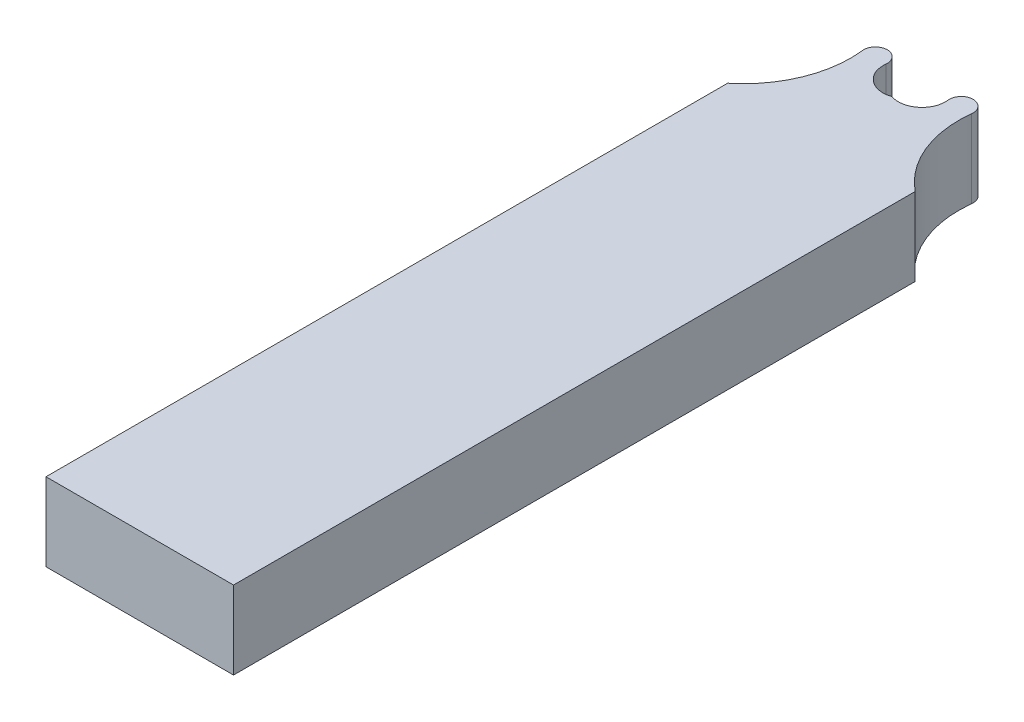
ISO-10303-21;
HEADER;
FILE_DESCRIPTION(('STEP AP214'),'2;1');
FILE_NAME('part.step','',(''),(''),'','','');
FILE_SCHEMA(('AUTOMOTIVE_DESIGN { 1 0 10303 214 1 1 1 1 }'));
ENDSEC;
DATA;
#1=APPLICATION_CONTEXT('core data for automotive mechanical design processes');
#2=APPLICATION_PROTOCOL_DEFINITION('international standard','automotive_design',2000,#1);
#3=PRODUCT_CONTEXT('',#1,'mechanical');
#4=PRODUCT('Part','Part','',(#3));
#5=PRODUCT_RELATED_PRODUCT_CATEGORY('part','',(#4));
#6=PRODUCT_DEFINITION_FORMATION('','',#4);
#7=PRODUCT_DEFINITION_CONTEXT('part definition',#1,'design');
#8=PRODUCT_DEFINITION('design','',#6,#7);
#9=PRODUCT_DEFINITION_SHAPE('','',#8);
#10=(LENGTH_UNIT() NAMED_UNIT(*) SI_UNIT(.MILLI.,.METRE.));
#11=(NAMED_UNIT(*) PLANE_ANGLE_UNIT() SI_UNIT($,.RADIAN.));
#12=(NAMED_UNIT(*) SI_UNIT($,.STERADIAN.) SOLID_ANGLE_UNIT());
#13=UNCERTAINTY_MEASURE_WITH_UNIT(LENGTH_MEASURE(1.E-05),#10,'distance_accuracy_value','');
#14=(GEOMETRIC_REPRESENTATION_CONTEXT(3) GLOBAL_UNCERTAINTY_ASSIGNED_CONTEXT((#13)) GLOBAL_UNIT_ASSIGNED_CONTEXT((#10,
#11,#12)) REPRESENTATION_CONTEXT('',''));
#15=CARTESIAN_POINT('',(0.,0.,0.));
#16=DIRECTION('',(0.,0.,1.));
#17=DIRECTION('',(1.,0.,0.));
#18=AXIS2_PLACEMENT_3D('',#15,#16,#17);
#19=CARTESIAN_POINT('',(-35.1155,0.,35.1155000000002));
#20=DIRECTION('',(-1.,0.,0.));
#21=DIRECTION('',(0.,0.,1.));
#22=AXIS2_PLACEMENT_3D('',#19,#20,#21);
#23=PLANE('',#22);
#24=DIRECTION('',(0.,-1.,0.));
#25=VECTOR('',#24,1.);
#26=CARTESIAN_POINT('',(-35.1155,29.21,-105.41));
#27=LINE('',#26,#25);
#28=CARTESIAN_POINT('',(-35.1155,29.21,-105.41));
#29=VERTEX_POINT('',#28);
#30=CARTESIAN_POINT('',(-35.1155,0.,-105.41));
#31=VERTEX_POINT('',#30);
#32=EDGE_CURVE('E144',#29,#31,#27,.T.);
#33=ORIENTED_EDGE('',*,*,#32,.T.);
#34=DIRECTION('',(0.,0.,1.));
#35=VECTOR('',#34,1.);
#36=CARTESIAN_POINT('',(-35.1155,0.,149.86));
#37=LINE('',#36,#35);
#38=CARTESIAN_POINT('',(-35.1155,0.,149.86));
#39=VERTEX_POINT('',#38);
#40=EDGE_CURVE('E11',#31,#39,#37,.T.);
#41=ORIENTED_EDGE('',*,*,#40,.T.);
#42=DIRECTION('',(0.,-1.,0.));
#43=VECTOR('',#42,1.);
#44=CARTESIAN_POINT('',(-35.1155,29.21,149.86));
#45=LINE('',#44,#43);
#46=CARTESIAN_POINT('',(-35.1155,29.21,149.86));
#47=VERTEX_POINT('',#46);
#48=EDGE_CURVE('E196',#47,#39,#45,.T.);
#49=ORIENTED_EDGE('',*,*,#48,.F.);
#50=DIRECTION('',(0.,0.,1.));
#51=VECTOR('',#50,1.);
#52=CARTESIAN_POINT('',(-35.1155,29.21,149.86));
#53=LINE('',#52,#51);
#54=EDGE_CURVE('E41',#29,#47,#53,.T.);
#55=ORIENTED_EDGE('',*,*,#54,.F.);
#56=EDGE_LOOP('',(#33,#41,#49,#55));
#57=FACE_BOUND('',#56,.T.);
#58=ADVANCED_FACE('F37',(#57),#23,.T.);
#59=CARTESIAN_POINT('',(35.1155,0.,-14.1463446288162));
#60=DIRECTION('',(1.,0.,0.));
#61=DIRECTION('',(0.,0.,-1.));
#62=AXIS2_PLACEMENT_3D('',#59,#60,#61);
#63=PLANE('',#62);
#64=DIRECTION('',(0.,-1.,0.));
#65=VECTOR('',#64,1.);
#66=CARTESIAN_POINT('',(35.1155,29.21,149.86));
#67=LINE('',#66,#65);
#68=CARTESIAN_POINT('',(35.1155,29.21,149.86));
#69=VERTEX_POINT('',#68);
#70=CARTESIAN_POINT('',(35.1155,0.,149.86));
#71=VERTEX_POINT('',#70);
#72=EDGE_CURVE('E120',#69,#71,#67,.T.);
#73=ORIENTED_EDGE('',*,*,#72,.T.);
#74=DIRECTION('',(0.,0.,-1.));
#75=VECTOR('',#74,1.);
#76=CARTESIAN_POINT('',(35.1155,0.,149.86));
#77=LINE('',#76,#75);
#78=CARTESIAN_POINT('',(35.1155,0.,-105.41));
#79=VERTEX_POINT('',#78);
#80=EDGE_CURVE('E114',#71,#79,#77,.T.);
#81=ORIENTED_EDGE('',*,*,#80,.T.);
#82=DIRECTION('',(0.,-1.,0.));
#83=VECTOR('',#82,1.);
#84=CARTESIAN_POINT('',(35.1155,29.21,-105.41));
#85=LINE('',#84,#83);
#86=CARTESIAN_POINT('',(35.1155,29.21,-105.41));
#87=VERTEX_POINT('',#86);
#88=EDGE_CURVE('E118',#87,#79,#85,.T.);
#89=ORIENTED_EDGE('',*,*,#88,.F.);
#90=DIRECTION('',(0.,0.,-1.));
#91=VECTOR('',#90,1.);
#92=CARTESIAN_POINT('',(35.1155,29.21,149.86));
#93=LINE('',#92,#91);
#94=EDGE_CURVE('E153',#69,#87,#93,.T.);
#95=ORIENTED_EDGE('',*,*,#94,.F.);
#96=EDGE_LOOP('',(#73,#81,#89,#95));
#97=FACE_BOUND('',#96,.T.);
#98=ADVANCED_FACE('F116',(#97),#63,.T.);
#99=CARTESIAN_POINT('',(-60.3181446143553,0.,-136.622759184095));
#100=DIRECTION('',(0.,-1.,0.));
#101=DIRECTION('',(0.,0.,-1.));
#102=AXIS2_PLACEMENT_3D('',#99,#100,#101);
#103=PLANE('',#102);
#104=ORIENTED_EDGE('',*,*,#40,.F.);
#105=CARTESIAN_POINT('',(-60.3181446143553,0.,-136.622759184095));
#106=DIRECTION('',(0.,-1.,0.));
#107=DIRECTION('',(0.,0.,-1.));
#108=AXIS2_PLACEMENT_3D('',#105,#106,#107);
#109=CIRCLE('',#108,40.1174479677087);
#110=CARTESIAN_POINT('',(-20.4654381266415,0.,-141.224));
#111=VERTEX_POINT('',#110);
#112=EDGE_CURVE('E154',#111,#31,#109,.T.);
#113=ORIENTED_EDGE('',*,*,#112,.F.);
#114=CARTESIAN_POINT('',(-16.0655,0.,-141.732));
#115=DIRECTION('',(0.,1.,0.));
#116=DIRECTION('',(0.,0.,-1.));
#117=AXIS2_PLACEMENT_3D('',#114,#115,#116);
#118=CIRCLE('',#117,4.42916691018457);
#119=CARTESIAN_POINT('',(-11.6655618733584,0.,-141.224));
#120=VERTEX_POINT('',#119);
#121=EDGE_CURVE('E156',#120,#111,#118,.T.);
#122=ORIENTED_EDGE('',*,*,#121,.F.);
#123=CARTESIAN_POINT('',(-2.8656856200749,0.,-140.208));
#124=DIRECTION('',(0.,-1.,0.));
#125=DIRECTION('',(0.,0.,1.));
#126=AXIS2_PLACEMENT_3D('',#123,#124,#125);
#127=CIRCLE('',#126,8.85833382036956);
#128=CARTESIAN_POINT('',(0.,0.,-131.826));
#129=VERTEX_POINT('',#128);
#130=EDGE_CURVE('E161',#129,#120,#127,.T.);
#131=ORIENTED_EDGE('',*,*,#130,.F.);
#132=CARTESIAN_POINT('',(2.86568562007493,0.,-140.208));
#133=DIRECTION('',(0.,-1.,0.));
#134=DIRECTION('',(0.,0.,-1.));
#135=AXIS2_PLACEMENT_3D('',#132,#133,#134);
#136=CIRCLE('',#135,8.85833382036956);
#137=CARTESIAN_POINT('',(11.6655618733585,0.,-141.224));
#138=VERTEX_POINT('',#137);
#139=EDGE_CURVE('E136',#138,#129,#136,.T.);
#140=ORIENTED_EDGE('',*,*,#139,.F.);
#141=CARTESIAN_POINT('',(16.0655,0.,-141.732));
#142=DIRECTION('',(0.,1.,0.));
#143=DIRECTION('',(0.,0.,1.));
#144=AXIS2_PLACEMENT_3D('',#141,#142,#143);
#145=CIRCLE('',#144,4.42916691018457);
#146=CARTESIAN_POINT('',(20.4654381266416,0.,-141.224));
#147=VERTEX_POINT('',#146);
#148=EDGE_CURVE('E134',#147,#138,#145,.T.);
#149=ORIENTED_EDGE('',*,*,#148,.F.);
#150=CARTESIAN_POINT('',(60.3181446143553,0.,-136.622759184095));
#151=DIRECTION('',(0.,-1.,0.));
#152=DIRECTION('',(0.,0.,1.));
#153=AXIS2_PLACEMENT_3D('',#150,#151,#152);
#154=CIRCLE('',#153,40.1174479677087);
#155=EDGE_CURVE('E123',#79,#147,#154,.T.);
#156=ORIENTED_EDGE('',*,*,#155,.F.);
#157=ORIENTED_EDGE('',*,*,#80,.F.);
#158=DIRECTION('',(1.,0.,0.));
#159=VECTOR('',#158,1.);
#160=CARTESIAN_POINT('',(-35.1155,0.,149.86));
#161=LINE('',#160,#159);
#162=EDGE_CURVE('E47',#39,#71,#161,.T.);
#163=ORIENTED_EDGE('',*,*,#162,.F.);
#164=EDGE_LOOP('',(#104,#113,#122,#131,#140,#149,#156,#157,#163));
#165=FACE_BOUND('',#164,.T.);
#166=ADVANCED_FACE('F39',(#165),#103,.T.);
#167=CARTESIAN_POINT('',(-35.1155,29.21,149.86));
#168=DIRECTION('',(0.,0.,-1.));
#169=DIRECTION('',(-1.,0.,0.));
#170=AXIS2_PLACEMENT_3D('',#167,#168,#169);
#171=PLANE('',#170);
#172=ORIENTED_EDGE('',*,*,#162,.T.);
#173=ORIENTED_EDGE('',*,*,#72,.F.);
#174=DIRECTION('',(1.,0.,0.));
#175=VECTOR('',#174,1.);
#176=CARTESIAN_POINT('',(-35.1155,29.21,149.86));
#177=LINE('',#176,#175);
#178=EDGE_CURVE('E86',#47,#69,#177,.T.);
#179=ORIENTED_EDGE('',*,*,#178,.F.);
#180=ORIENTED_EDGE('',*,*,#48,.T.);
#181=EDGE_LOOP('',(#172,#173,#179,#180));
#182=FACE_BOUND('',#181,.T.);
#183=ADVANCED_FACE('F197',(#182),#171,.F.);
#184=CARTESIAN_POINT('',(60.3181446143553,29.21,-136.622759184095));
#185=DIRECTION('',(0.,-1.,0.));
#186=DIRECTION('',(0.,0.,-1.));
#187=AXIS2_PLACEMENT_3D('',#184,#185,#186);
#188=CYLINDRICAL_SURFACE('',#187,40.1174479677087);
#189=ORIENTED_EDGE('',*,*,#155,.T.);
#190=DIRECTION('',(0.,-1.,0.));
#191=VECTOR('',#190,1.);
#192=CARTESIAN_POINT('',(20.4654381266416,29.21,-141.224));
#193=LINE('',#192,#191);
#194=CARTESIAN_POINT('',(20.4654381266416,29.21,-141.224));
#195=VERTEX_POINT('',#194);
#196=EDGE_CURVE('E130',#195,#147,#193,.T.);
#197=ORIENTED_EDGE('',*,*,#196,.F.);
#198=CARTESIAN_POINT('',(60.3181446143553,29.21,-136.622759184095));
#199=DIRECTION('',(0.,-1.,0.));
#200=DIRECTION('',(0.,0.,1.));
#201=AXIS2_PLACEMENT_3D('',#198,#199,#200);
#202=CIRCLE('',#201,40.1174479677087);
#203=EDGE_CURVE('E129',#87,#195,#202,.T.);
#204=ORIENTED_EDGE('',*,*,#203,.F.);
#205=ORIENTED_EDGE('',*,*,#88,.T.);
#206=EDGE_LOOP('',(#189,#197,#204,#205));
#207=FACE_BOUND('',#206,.T.);
#208=ADVANCED_FACE('F126',(#207),#188,.F.);
#209=CARTESIAN_POINT('',(16.0655,29.21,-141.732));
#210=DIRECTION('',(0.,-1.,0.));
#211=DIRECTION('',(0.,0.,-1.));
#212=AXIS2_PLACEMENT_3D('',#209,#210,#211);
#213=CYLINDRICAL_SURFACE('',#212,4.42916691018457);
#214=ORIENTED_EDGE('',*,*,#148,.T.);
#215=DIRECTION('',(0.,-1.,0.));
#216=VECTOR('',#215,1.);
#217=CARTESIAN_POINT('',(11.6655618733585,29.21,-141.224));
#218=LINE('',#217,#216);
#219=CARTESIAN_POINT('',(11.6655618733585,29.21,-141.224));
#220=VERTEX_POINT('',#219);
#221=EDGE_CURVE('E175',#220,#138,#218,.T.);
#222=ORIENTED_EDGE('',*,*,#221,.F.);
#223=CARTESIAN_POINT('',(16.0655,29.21,-141.732));
#224=DIRECTION('',(0.,1.,0.));
#225=DIRECTION('',(0.,0.,1.));
#226=AXIS2_PLACEMENT_3D('',#223,#224,#225);
#227=CIRCLE('',#226,4.42916691018457);
#228=EDGE_CURVE('E150',#195,#220,#227,.T.);
#229=ORIENTED_EDGE('',*,*,#228,.F.);
#230=ORIENTED_EDGE('',*,*,#196,.T.);
#231=EDGE_LOOP('',(#214,#222,#229,#230));
#232=FACE_BOUND('',#231,.T.);
#233=ADVANCED_FACE('F214',(#232),#213,.T.);
#234=CARTESIAN_POINT('',(2.86568562007493,29.21,-140.208));
#235=DIRECTION('',(0.,-1.,0.));
#236=DIRECTION('',(0.,0.,-1.));
#237=AXIS2_PLACEMENT_3D('',#234,#235,#236);
#238=CYLINDRICAL_SURFACE('',#237,8.85833382036956);
#239=ORIENTED_EDGE('',*,*,#139,.T.);
#240=DIRECTION('',(0.,-1.,0.));
#241=VECTOR('',#240,1.);
#242=CARTESIAN_POINT('',(0.,29.21,-131.826));
#243=LINE('',#242,#241);
#244=CARTESIAN_POINT('',(0.,29.21,-131.826));
#245=VERTEX_POINT('',#244);
#246=EDGE_CURVE('E172',#245,#129,#243,.T.);
#247=ORIENTED_EDGE('',*,*,#246,.F.);
#248=CARTESIAN_POINT('',(2.86568562007493,29.21,-140.208));
#249=DIRECTION('',(0.,-1.,0.));
#250=DIRECTION('',(0.,0.,-1.));
#251=AXIS2_PLACEMENT_3D('',#248,#249,#250);
#252=CIRCLE('',#251,8.85833382036956);
#253=EDGE_CURVE('E148',#220,#245,#252,.T.);
#254=ORIENTED_EDGE('',*,*,#253,.F.);
#255=ORIENTED_EDGE('',*,*,#221,.T.);
#256=EDGE_LOOP('',(#239,#247,#254,#255));
#257=FACE_BOUND('',#256,.T.);
#258=ADVANCED_FACE('F170',(#257),#238,.F.);
#259=CARTESIAN_POINT('',(-2.8656856200749,29.21,-140.208));
#260=DIRECTION('',(0.,-1.,0.));
#261=DIRECTION('',(0.,0.,-1.));
#262=AXIS2_PLACEMENT_3D('',#259,#260,#261);
#263=CYLINDRICAL_SURFACE('',#262,8.85833382036956);
#264=ORIENTED_EDGE('',*,*,#130,.T.);
#265=DIRECTION('',(0.,-1.,0.));
#266=VECTOR('',#265,1.);
#267=CARTESIAN_POINT('',(-11.6655618733584,29.21,-141.224));
#268=LINE('',#267,#266);
#269=CARTESIAN_POINT('',(-11.6655618733584,29.21,-141.224));
#270=VERTEX_POINT('',#269);
#271=EDGE_CURVE('E181',#270,#120,#268,.T.);
#272=ORIENTED_EDGE('',*,*,#271,.F.);
#273=CARTESIAN_POINT('',(-2.8656856200749,29.21,-140.208));
#274=DIRECTION('',(0.,-1.,0.));
#275=DIRECTION('',(0.,0.,1.));
#276=AXIS2_PLACEMENT_3D('',#273,#274,#275);
#277=CIRCLE('',#276,8.85833382036956);
#278=EDGE_CURVE('E146',#245,#270,#277,.T.);
#279=ORIENTED_EDGE('',*,*,#278,.F.);
#280=ORIENTED_EDGE('',*,*,#246,.T.);
#281=EDGE_LOOP('',(#264,#272,#279,#280));
#282=FACE_BOUND('',#281,.T.);
#283=ADVANCED_FACE('F178',(#282),#263,.F.);
#284=CARTESIAN_POINT('',(-16.0655,29.21,-141.732));
#285=DIRECTION('',(0.,-1.,0.));
#286=DIRECTION('',(0.,0.,-1.));
#287=AXIS2_PLACEMENT_3D('',#284,#285,#286);
#288=CYLINDRICAL_SURFACE('',#287,4.42916691018457);
#289=ORIENTED_EDGE('',*,*,#121,.T.);
#290=DIRECTION('',(0.,-1.,0.));
#291=VECTOR('',#290,1.);
#292=CARTESIAN_POINT('',(-20.4654381266415,29.21,-141.224));
#293=LINE('',#292,#291);
#294=CARTESIAN_POINT('',(-20.4654381266415,29.21,-141.224));
#295=VERTEX_POINT('',#294);
#296=EDGE_CURVE('E188',#295,#111,#293,.T.);
#297=ORIENTED_EDGE('',*,*,#296,.F.);
#298=CARTESIAN_POINT('',(-16.0655,29.21,-141.732));
#299=DIRECTION('',(0.,1.,0.));
#300=DIRECTION('',(0.,0.,-1.));
#301=AXIS2_PLACEMENT_3D('',#298,#299,#300);
#302=CIRCLE('',#301,4.42916691018457);
#303=EDGE_CURVE('E143',#270,#295,#302,.T.);
#304=ORIENTED_EDGE('',*,*,#303,.F.);
#305=ORIENTED_EDGE('',*,*,#271,.T.);
#306=EDGE_LOOP('',(#289,#297,#304,#305));
#307=FACE_BOUND('',#306,.T.);
#308=ADVANCED_FACE('F186',(#307),#288,.T.);
#309=CARTESIAN_POINT('',(-60.3181446143553,29.21,-136.622759184095));
#310=DIRECTION('',(0.,-1.,0.));
#311=DIRECTION('',(0.,0.,-1.));
#312=AXIS2_PLACEMENT_3D('',#309,#310,#311);
#313=CYLINDRICAL_SURFACE('',#312,40.1174479677087);
#314=ORIENTED_EDGE('',*,*,#112,.T.);
#315=ORIENTED_EDGE('',*,*,#32,.F.);
#316=CARTESIAN_POINT('',(-60.3181446143553,29.21,-136.622759184095));
#317=DIRECTION('',(0.,-1.,0.));
#318=DIRECTION('',(0.,0.,-1.));
#319=AXIS2_PLACEMENT_3D('',#316,#317,#318);
#320=CIRCLE('',#319,40.1174479677087);
#321=EDGE_CURVE('E141',#295,#29,#320,.T.);
#322=ORIENTED_EDGE('',*,*,#321,.F.);
#323=ORIENTED_EDGE('',*,*,#296,.T.);
#324=EDGE_LOOP('',(#314,#315,#322,#323));
#325=FACE_BOUND('',#324,.T.);
#326=ADVANCED_FACE('F190',(#325),#313,.F.);
#327=CARTESIAN_POINT('',(-60.3181446143553,29.21,-136.622759184095));
#328=DIRECTION('',(0.,-1.,0.));
#329=DIRECTION('',(0.,0.,-1.));
#330=AXIS2_PLACEMENT_3D('',#327,#328,#329);
#331=PLANE('',#330);
#332=ORIENTED_EDGE('',*,*,#54,.T.);
#333=ORIENTED_EDGE('',*,*,#178,.T.);
#334=ORIENTED_EDGE('',*,*,#94,.T.);
#335=ORIENTED_EDGE('',*,*,#203,.T.);
#336=ORIENTED_EDGE('',*,*,#228,.T.);
#337=ORIENTED_EDGE('',*,*,#253,.T.);
#338=ORIENTED_EDGE('',*,*,#278,.T.);
#339=ORIENTED_EDGE('',*,*,#303,.T.);
#340=ORIENTED_EDGE('',*,*,#321,.T.);
#341=EDGE_LOOP('',(#332,#333,#334,#335,#336,#337,#338,#339,#340));
#342=FACE_BOUND('',#341,.T.);
#343=ADVANCED_FACE('F199',(#342),#331,.F.);
#344=CLOSED_SHELL('',(#58,#98,#166,#183,#208,#233,#258,#283,#308,#326,#343));
#345=MANIFOLD_SOLID_BREP('B2',#344);
#346=ADVANCED_BREP_SHAPE_REPRESENTATION('',(#18,#345),#14);
#347=SHAPE_DEFINITION_REPRESENTATION(#9,#346);
ENDSEC;
END-ISO-10303-21;
